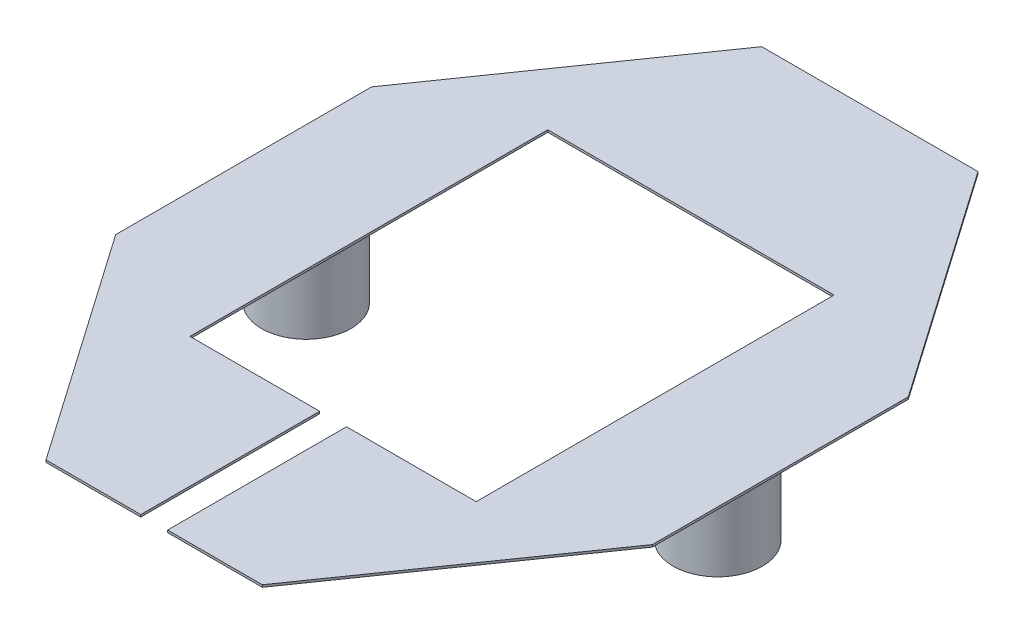
ISO-10303-21;
HEADER;
FILE_DESCRIPTION(('STEP AP214'),'2;1');
FILE_NAME('part.step','',(''),(''),'','','');
FILE_SCHEMA(('AUTOMOTIVE_DESIGN { 1 0 10303 214 1 1 1 1 }'));
ENDSEC;
DATA;
#1=APPLICATION_CONTEXT('core data for automotive mechanical design processes');
#2=APPLICATION_PROTOCOL_DEFINITION('international standard','automotive_design',2000,#1);
#3=PRODUCT_CONTEXT('',#1,'mechanical');
#4=PRODUCT('Part','Part','',(#3));
#5=PRODUCT_RELATED_PRODUCT_CATEGORY('part','',(#4));
#6=PRODUCT_DEFINITION_FORMATION('','',#4);
#7=PRODUCT_DEFINITION_CONTEXT('part definition',#1,'design');
#8=PRODUCT_DEFINITION('design','',#6,#7);
#9=PRODUCT_DEFINITION_SHAPE('','',#8);
#10=(LENGTH_UNIT() NAMED_UNIT(*) SI_UNIT(.MILLI.,.METRE.));
#11=(NAMED_UNIT(*) PLANE_ANGLE_UNIT() SI_UNIT($,.RADIAN.));
#12=(NAMED_UNIT(*) SI_UNIT($,.STERADIAN.) SOLID_ANGLE_UNIT());
#13=UNCERTAINTY_MEASURE_WITH_UNIT(LENGTH_MEASURE(1.E-05),#10,'distance_accuracy_value','');
#14=(GEOMETRIC_REPRESENTATION_CONTEXT(3) GLOBAL_UNCERTAINTY_ASSIGNED_CONTEXT((#13)) GLOBAL_UNIT_ASSIGNED_CONTEXT((#10,
#11,#12)) REPRESENTATION_CONTEXT('',''));
#15=CARTESIAN_POINT('',(0.,0.,0.));
#16=DIRECTION('',(0.,0.,1.));
#17=DIRECTION('',(1.,0.,0.));
#18=AXIS2_PLACEMENT_3D('',#15,#16,#17);
#19=CARTESIAN_POINT('',(0.,0.25,0.));
#20=DIRECTION('',(0.,1.,0.));
#21=DIRECTION('',(0.,0.,1.));
#22=AXIS2_PLACEMENT_3D('',#19,#20,#21);
#23=PLANE('',#22);
#24=DIRECTION('',(0.571792661688173,0.,-0.820398166769987));
#25=VECTOR('',#24,1.);
#26=CARTESIAN_POINT('',(5.,0.25,21.5));
#27=LINE('',#26,#25);
#28=CARTESIAN_POINT('',(6.04545454545455,0.25,20.));
#29=VERTEX_POINT('',#28);
#30=CARTESIAN_POINT('',(15.,0.249999999999999,7.15217391304348));
#31=VERTEX_POINT('',#30);
#32=EDGE_CURVE('E176',#29,#31,#27,.T.);
#33=ORIENTED_EDGE('',*,*,#32,.F.);
#34=DIRECTION('',(-1.,0.,0.));
#35=VECTOR('',#34,1.);
#36=CARTESIAN_POINT('',(5.,0.25,20.));
#37=LINE('',#36,#35);
#38=CARTESIAN_POINT('',(0.75,0.25,20.));
#39=VERTEX_POINT('',#38);
#40=EDGE_CURVE('E155',#29,#39,#37,.T.);
#41=ORIENTED_EDGE('',*,*,#40,.T.);
#42=DIRECTION('',(0.,0.,1.));
#43=VECTOR('',#42,1.);
#44=CARTESIAN_POINT('',(0.75,0.25,10.));
#45=LINE('',#44,#43);
#46=CARTESIAN_POINT('',(0.75,0.25,10.));
#47=VERTEX_POINT('',#46);
#48=EDGE_CURVE('E162',#47,#39,#45,.T.);
#49=ORIENTED_EDGE('',*,*,#48,.F.);
#50=DIRECTION('',(-1.,0.,0.));
#51=VECTOR('',#50,1.);
#52=CARTESIAN_POINT('',(-8.,0.25,10.));
#53=LINE('',#52,#51);
#54=CARTESIAN_POINT('',(8.,0.25,10.));
#55=VERTEX_POINT('',#54);
#56=EDGE_CURVE('E369',#55,#47,#53,.T.);
#57=ORIENTED_EDGE('',*,*,#56,.F.);
#58=DIRECTION('',(0.,0.,1.));
#59=VECTOR('',#58,1.);
#60=CARTESIAN_POINT('',(8.,0.25,-10.));
#61=LINE('',#60,#59);
#62=CARTESIAN_POINT('',(8.,0.25,-10.));
#63=VERTEX_POINT('',#62);
#64=EDGE_CURVE('E365',#63,#55,#61,.T.);
#65=ORIENTED_EDGE('',*,*,#64,.F.);
#66=DIRECTION('',(1.,0.,0.));
#67=VECTOR('',#66,1.);
#68=CARTESIAN_POINT('',(-8.,0.25,-10.));
#69=LINE('',#68,#67);
#70=CARTESIAN_POINT('',(-8.,0.25,-10.));
#71=VERTEX_POINT('',#70);
#72=EDGE_CURVE('E362',#71,#63,#69,.T.);
#73=ORIENTED_EDGE('',*,*,#72,.F.);
#74=DIRECTION('',(0.,0.,-1.));
#75=VECTOR('',#74,1.);
#76=CARTESIAN_POINT('',(-8.,0.25,-10.));
#77=LINE('',#76,#75);
#78=CARTESIAN_POINT('',(-8.,0.25,10.));
#79=VERTEX_POINT('',#78);
#80=EDGE_CURVE('E360',#79,#71,#77,.T.);
#81=ORIENTED_EDGE('',*,*,#80,.F.);
#82=CARTESIAN_POINT('',(-0.750000000000001,0.25,10.));
#83=VERTEX_POINT('',#82);
#84=EDGE_CURVE('E368',#83,#79,#53,.T.);
#85=ORIENTED_EDGE('',*,*,#84,.F.);
#86=DIRECTION('',(0.,0.,-1.));
#87=VECTOR('',#86,1.);
#88=CARTESIAN_POINT('',(-0.750000000000001,0.25,10.));
#89=LINE('',#88,#87);
#90=CARTESIAN_POINT('',(-0.75,0.25,20.));
#91=VERTEX_POINT('',#90);
#92=EDGE_CURVE('E171',#91,#83,#89,.T.);
#93=ORIENTED_EDGE('',*,*,#92,.F.);
#94=CARTESIAN_POINT('',(-6.04545454545455,0.249999999999999,20.));
#95=VERTEX_POINT('',#94);
#96=EDGE_CURVE('E177',#91,#95,#37,.T.);
#97=ORIENTED_EDGE('',*,*,#96,.T.);
#98=DIRECTION('',(0.571792661688173,0.,0.820398166769987));
#99=VECTOR('',#98,1.);
#100=CARTESIAN_POINT('',(-5.,0.25,21.5));
#101=LINE('',#100,#99);
#102=CARTESIAN_POINT('',(-15.,0.25,7.15217391304348));
#103=VERTEX_POINT('',#102);
#104=EDGE_CURVE('E355',#103,#95,#101,.T.);
#105=ORIENTED_EDGE('',*,*,#104,.F.);
#106=DIRECTION('',(0.,0.,-1.));
#107=VECTOR('',#106,1.);
#108=CARTESIAN_POINT('',(-15.,0.25,5.));
#109=LINE('',#108,#107);
#110=CARTESIAN_POINT('',(-15.,0.249999999999999,-7.15217391304348));
#111=VERTEX_POINT('',#110);
#112=EDGE_CURVE('E392',#103,#111,#109,.T.);
#113=ORIENTED_EDGE('',*,*,#112,.T.);
#114=DIRECTION('',(-0.571792661688173,0.,0.820398166769987));
#115=VECTOR('',#114,1.);
#116=CARTESIAN_POINT('',(-16.5,0.25,-5.));
#117=LINE('',#116,#115);
#118=CARTESIAN_POINT('',(-6.04545454545455,0.25,-20.));
#119=VERTEX_POINT('',#118);
#120=EDGE_CURVE('E346',#119,#111,#117,.T.);
#121=ORIENTED_EDGE('',*,*,#120,.F.);
#122=DIRECTION('',(1.,0.,0.));
#123=VECTOR('',#122,1.);
#124=CARTESIAN_POINT('',(-5.,0.25,-20.));
#125=LINE('',#124,#123);
#126=CARTESIAN_POINT('',(6.04545454545454,0.249999999999999,-20.));
#127=VERTEX_POINT('',#126);
#128=EDGE_CURVE('E393',#119,#127,#125,.T.);
#129=ORIENTED_EDGE('',*,*,#128,.T.);
#130=DIRECTION('',(-0.571792661688173,0.,-0.820398166769987));
#131=VECTOR('',#130,1.);
#132=CARTESIAN_POINT('',(16.5,0.25,-5.));
#133=LINE('',#132,#131);
#134=CARTESIAN_POINT('',(15.,0.25,-7.15217391304348));
#135=VERTEX_POINT('',#134);
#136=EDGE_CURVE('E341',#135,#127,#133,.T.);
#137=ORIENTED_EDGE('',*,*,#136,.F.);
#138=DIRECTION('',(0.,0.,1.));
#139=VECTOR('',#138,1.);
#140=CARTESIAN_POINT('',(15.,0.25,-5.));
#141=LINE('',#140,#139);
#142=EDGE_CURVE('E181',#135,#31,#141,.T.);
#143=ORIENTED_EDGE('',*,*,#142,.T.);
#144=EDGE_LOOP('',(#33,#41,#49,#57,#65,#73,#81,#85,#93,#97,#105,#113,#121,#129,#137,#143));
#145=FACE_BOUND('',#144,.T.);
#146=CARTESIAN_POINT('',(-11.5,0.25,0.));
#147=DIRECTION('',(0.,1.,0.));
#148=DIRECTION('',(0.,0.,1.));
#149=AXIS2_PLACEMENT_3D('',#146,#147,#148);
#150=CIRCLE('',#149,2.5);
#151=CARTESIAN_POINT('',(-11.5,0.25,2.5));
#152=VERTEX_POINT('',#151);
#153=EDGE_CURVE('E43',#152,#152,#150,.F.);
#154=ORIENTED_EDGE('',*,*,#153,.F.);
#155=EDGE_LOOP('',(#154));
#156=FACE_BOUND('',#155,.T.);
#157=CARTESIAN_POINT('',(11.5,0.25,0.));
#158=DIRECTION('',(0.,1.,0.));
#159=DIRECTION('',(0.,0.,1.));
#160=AXIS2_PLACEMENT_3D('',#157,#158,#159);
#161=CIRCLE('',#160,2.5);
#162=CARTESIAN_POINT('',(11.5,0.25,2.5));
#163=VERTEX_POINT('',#162);
#164=EDGE_CURVE('E11',#163,#163,#161,.F.);
#165=ORIENTED_EDGE('',*,*,#164,.F.);
#166=EDGE_LOOP('',(#165));
#167=FACE_BOUND('',#166,.T.);
#168=ADVANCED_FACE('F35',(#145,#156,#167),#23,.F.);
#169=CARTESIAN_POINT('',(-8.,4.375,10.));
#170=DIRECTION('',(0.,0.,1.));
#171=DIRECTION('',(1.,0.,0.));
#172=AXIS2_PLACEMENT_3D('',#169,#170,#171);
#173=PLANE('',#172);
#174=DIRECTION('',(1.,0.,0.));
#175=VECTOR('',#174,1.);
#176=CARTESIAN_POINT('',(0.,0.375,10.));
#177=LINE('',#176,#175);
#178=CARTESIAN_POINT('',(-8.,0.375,10.));
#179=VERTEX_POINT('',#178);
#180=CARTESIAN_POINT('',(-0.750000000000001,0.375,10.));
#181=VERTEX_POINT('',#180);
#182=EDGE_CURVE('E387',#179,#181,#177,.T.);
#183=ORIENTED_EDGE('',*,*,#182,.T.);
#184=DIRECTION('',(0.,-1.,0.));
#185=VECTOR('',#184,1.);
#186=CARTESIAN_POINT('',(-0.750000000000001,4.375,10.));
#187=LINE('',#186,#185);
#188=EDGE_CURVE('E179',#181,#83,#187,.T.);
#189=ORIENTED_EDGE('',*,*,#188,.T.);
#190=ORIENTED_EDGE('',*,*,#84,.T.);
#191=DIRECTION('',(0.,-1.,0.));
#192=VECTOR('',#191,1.);
#193=CARTESIAN_POINT('',(-8.,4.375,10.));
#194=LINE('',#193,#192);
#195=EDGE_CURVE('E372',#179,#79,#194,.T.);
#196=ORIENTED_EDGE('',*,*,#195,.F.);
#197=EDGE_LOOP('',(#183,#189,#190,#196));
#198=FACE_BOUND('',#197,.T.);
#199=ADVANCED_FACE('F199',(#198),#173,.F.);
#200=CARTESIAN_POINT('',(0.,0.375,0.));
#201=DIRECTION('',(0.,1.,0.));
#202=DIRECTION('',(0.,0.,1.));
#203=AXIS2_PLACEMENT_3D('',#200,#201,#202);
#204=PLANE('',#203);
#205=DIRECTION('',(-1.,0.,0.));
#206=VECTOR('',#205,1.);
#207=CARTESIAN_POINT('',(0.,0.375,20.));
#208=LINE('',#207,#206);
#209=CARTESIAN_POINT('',(6.04545454545455,0.375,20.));
#210=VERTEX_POINT('',#209);
#211=CARTESIAN_POINT('',(0.75,0.375,20.));
#212=VERTEX_POINT('',#211);
#213=EDGE_CURVE('E158',#210,#212,#208,.T.);
#214=ORIENTED_EDGE('',*,*,#213,.F.);
#215=DIRECTION('',(-0.571792661688173,0.,0.820398166769987));
#216=VECTOR('',#215,1.);
#217=CARTESIAN_POINT('',(13.4508652657602,0.375,9.37484548825711));
#218=LINE('',#217,#216);
#219=CARTESIAN_POINT('',(15.,0.375,7.15217391304347));
#220=VERTEX_POINT('',#219);
#221=EDGE_CURVE('E352',#220,#210,#218,.T.);
#222=ORIENTED_EDGE('',*,*,#221,.F.);
#223=DIRECTION('',(0.,0.,1.));
#224=VECTOR('',#223,1.);
#225=CARTESIAN_POINT('',(15.,0.375,0.));
#226=LINE('',#225,#224);
#227=CARTESIAN_POINT('',(15.,0.375,-7.15217391304348));
#228=VERTEX_POINT('',#227);
#229=EDGE_CURVE('E328',#228,#220,#226,.T.);
#230=ORIENTED_EDGE('',*,*,#229,.F.);
#231=DIRECTION('',(0.571792661688173,0.,0.820398166769987));
#232=VECTOR('',#231,1.);
#233=CARTESIAN_POINT('',(13.4508652657602,0.375,-9.37484548825711));
#234=LINE('',#233,#232);
#235=CARTESIAN_POINT('',(6.04545454545454,0.375,-20.));
#236=VERTEX_POINT('',#235);
#237=EDGE_CURVE('E344',#236,#228,#234,.T.);
#238=ORIENTED_EDGE('',*,*,#237,.F.);
#239=DIRECTION('',(1.,0.,0.));
#240=VECTOR('',#239,1.);
#241=CARTESIAN_POINT('',(0.,0.375,-20.));
#242=LINE('',#241,#240);
#243=CARTESIAN_POINT('',(-6.04545454545455,0.375,-20.));
#244=VERTEX_POINT('',#243);
#245=EDGE_CURVE('E58',#244,#236,#242,.T.);
#246=ORIENTED_EDGE('',*,*,#245,.F.);
#247=DIRECTION('',(0.571792661688173,0.,-0.820398166769987));
#248=VECTOR('',#247,1.);
#249=CARTESIAN_POINT('',(-13.4508652657602,0.375,-9.37484548825711));
#250=LINE('',#249,#248);
#251=CARTESIAN_POINT('',(-15.,0.375,-7.15217391304348));
#252=VERTEX_POINT('',#251);
#253=EDGE_CURVE('E349',#252,#244,#250,.T.);
#254=ORIENTED_EDGE('',*,*,#253,.F.);
#255=DIRECTION('',(0.,0.,-1.));
#256=VECTOR('',#255,1.);
#257=CARTESIAN_POINT('',(-15.,0.375,0.));
#258=LINE('',#257,#256);
#259=CARTESIAN_POINT('',(-15.,0.375,7.15217391304348));
#260=VERTEX_POINT('',#259);
#261=EDGE_CURVE('E50',#260,#252,#258,.T.);
#262=ORIENTED_EDGE('',*,*,#261,.F.);
#263=DIRECTION('',(-0.571792661688173,0.,-0.820398166769987));
#264=VECTOR('',#263,1.);
#265=CARTESIAN_POINT('',(-13.4508652657602,0.375,9.37484548825711));
#266=LINE('',#265,#264);
#267=CARTESIAN_POINT('',(-6.04545454545455,0.375,20.));
#268=VERTEX_POINT('',#267);
#269=EDGE_CURVE('E358',#268,#260,#266,.T.);
#270=ORIENTED_EDGE('',*,*,#269,.F.);
#271=CARTESIAN_POINT('',(-0.75,0.375,20.));
#272=VERTEX_POINT('',#271);
#273=EDGE_CURVE('E314',#272,#268,#208,.T.);
#274=ORIENTED_EDGE('',*,*,#273,.F.);
#275=DIRECTION('',(0.,0.,1.));
#276=VECTOR('',#275,1.);
#277=CARTESIAN_POINT('',(-0.750000000000001,0.375,0.));
#278=LINE('',#277,#276);
#279=EDGE_CURVE('E338',#181,#272,#278,.T.);
#280=ORIENTED_EDGE('',*,*,#279,.F.);
#281=ORIENTED_EDGE('',*,*,#182,.F.);
#282=DIRECTION('',(0.,0.,1.));
#283=VECTOR('',#282,1.);
#284=CARTESIAN_POINT('',(-8.,0.375,0.));
#285=LINE('',#284,#283);
#286=CARTESIAN_POINT('',(-8.,0.375,-10.));
#287=VERTEX_POINT('',#286);
#288=EDGE_CURVE('E390',#287,#179,#285,.T.);
#289=ORIENTED_EDGE('',*,*,#288,.F.);
#290=DIRECTION('',(-1.,0.,0.));
#291=VECTOR('',#290,1.);
#292=CARTESIAN_POINT('',(0.,0.375,-10.));
#293=LINE('',#292,#291);
#294=CARTESIAN_POINT('',(8.,0.375,-10.));
#295=VERTEX_POINT('',#294);
#296=EDGE_CURVE('E375',#295,#287,#293,.T.);
#297=ORIENTED_EDGE('',*,*,#296,.F.);
#298=DIRECTION('',(0.,0.,-1.));
#299=VECTOR('',#298,1.);
#300=CARTESIAN_POINT('',(8.,0.375,0.));
#301=LINE('',#300,#299);
#302=CARTESIAN_POINT('',(8.,0.375,10.));
#303=VERTEX_POINT('',#302);
#304=EDGE_CURVE('E383',#303,#295,#301,.T.);
#305=ORIENTED_EDGE('',*,*,#304,.F.);
#306=CARTESIAN_POINT('',(0.750000000000001,0.375,10.));
#307=VERTEX_POINT('',#306);
#308=EDGE_CURVE('E386',#307,#303,#177,.T.);
#309=ORIENTED_EDGE('',*,*,#308,.F.);
#310=DIRECTION('',(0.,0.,-1.));
#311=VECTOR('',#310,1.);
#312=CARTESIAN_POINT('',(0.75,0.375,0.));
#313=LINE('',#312,#311);
#314=EDGE_CURVE('E335',#212,#307,#313,.T.);
#315=ORIENTED_EDGE('',*,*,#314,.F.);
#316=EDGE_LOOP('',(#214,#222,#230,#238,#246,#254,#262,#270,#274,#280,#281,#289,#297,#305,#309,#315));
#317=FACE_BOUND('',#316,.T.);
#318=ADVANCED_FACE('F37',(#317),#204,.T.);
#319=CARTESIAN_POINT('',(-8.,4.375,-10.));
#320=DIRECTION('',(-1.,0.,0.));
#321=DIRECTION('',(0.,0.,1.));
#322=AXIS2_PLACEMENT_3D('',#319,#320,#321);
#323=PLANE('',#322);
#324=ORIENTED_EDGE('',*,*,#288,.T.);
#325=ORIENTED_EDGE('',*,*,#195,.T.);
#326=ORIENTED_EDGE('',*,*,#80,.T.);
#327=DIRECTION('',(0.,-1.,0.));
#328=VECTOR('',#327,1.);
#329=CARTESIAN_POINT('',(-8.,4.375,-10.));
#330=LINE('',#329,#328);
#331=EDGE_CURVE('E371',#287,#71,#330,.T.);
#332=ORIENTED_EDGE('',*,*,#331,.F.);
#333=EDGE_LOOP('',(#324,#325,#326,#332));
#334=FACE_BOUND('',#333,.T.);
#335=ADVANCED_FACE('F271',(#334),#323,.F.);
#336=ORIENTED_EDGE('',*,*,#56,.T.);
#337=DIRECTION('',(0.,1.,0.));
#338=VECTOR('',#337,1.);
#339=CARTESIAN_POINT('',(0.750000000000001,4.375,10.));
#340=LINE('',#339,#338);
#341=EDGE_CURVE('E167',#47,#307,#340,.T.);
#342=ORIENTED_EDGE('',*,*,#341,.T.);
#343=ORIENTED_EDGE('',*,*,#308,.T.);
#344=DIRECTION('',(0.,-1.,0.));
#345=VECTOR('',#344,1.);
#346=CARTESIAN_POINT('',(8.,4.375,10.));
#347=LINE('',#346,#345);
#348=EDGE_CURVE('E376',#303,#55,#347,.T.);
#349=ORIENTED_EDGE('',*,*,#348,.T.);
#350=EDGE_LOOP('',(#336,#342,#343,#349));
#351=FACE_BOUND('',#350,.T.);
#352=ADVANCED_FACE('F267',(#351),#173,.F.);
#353=CARTESIAN_POINT('',(8.,4.375,-10.));
#354=DIRECTION('',(1.,0.,0.));
#355=DIRECTION('',(0.,0.,-1.));
#356=AXIS2_PLACEMENT_3D('',#353,#354,#355);
#357=PLANE('',#356);
#358=ORIENTED_EDGE('',*,*,#304,.T.);
#359=DIRECTION('',(0.,-1.,0.));
#360=VECTOR('',#359,1.);
#361=CARTESIAN_POINT('',(8.,4.375,-10.));
#362=LINE('',#361,#360);
#363=EDGE_CURVE('E378',#295,#63,#362,.T.);
#364=ORIENTED_EDGE('',*,*,#363,.T.);
#365=ORIENTED_EDGE('',*,*,#64,.T.);
#366=ORIENTED_EDGE('',*,*,#348,.F.);
#367=EDGE_LOOP('',(#358,#364,#365,#366));
#368=FACE_BOUND('',#367,.T.);
#369=ADVANCED_FACE('F270',(#368),#357,.F.);
#370=CARTESIAN_POINT('',(-8.,4.375,-10.));
#371=DIRECTION('',(0.,0.,-1.));
#372=DIRECTION('',(-1.,0.,0.));
#373=AXIS2_PLACEMENT_3D('',#370,#371,#372);
#374=PLANE('',#373);
#375=ORIENTED_EDGE('',*,*,#296,.T.);
#376=ORIENTED_EDGE('',*,*,#331,.T.);
#377=ORIENTED_EDGE('',*,*,#72,.T.);
#378=ORIENTED_EDGE('',*,*,#363,.F.);
#379=EDGE_LOOP('',(#375,#376,#377,#378));
#380=FACE_BOUND('',#379,.T.);
#381=ADVANCED_FACE('F265',(#380),#374,.F.);
#382=CARTESIAN_POINT('',(-5.,4.375,21.5));
#383=DIRECTION('',(0.820398166769987,0.,-0.571792661688173));
#384=DIRECTION('',(-0.571792661688173,0.,-0.820398166769987));
#385=AXIS2_PLACEMENT_3D('',#382,#383,#384);
#386=PLANE('',#385);
#387=ORIENTED_EDGE('',*,*,#104,.T.);
#388=DIRECTION('',(0.,1.,0.));
#389=VECTOR('',#388,1.);
#390=CARTESIAN_POINT('',(-6.04545454545455,4.375,20.));
#391=LINE('',#390,#389);
#392=EDGE_CURVE('E316',#95,#268,#391,.T.);
#393=ORIENTED_EDGE('',*,*,#392,.T.);
#394=ORIENTED_EDGE('',*,*,#269,.T.);
#395=DIRECTION('',(0.,-1.,0.));
#396=VECTOR('',#395,1.);
#397=CARTESIAN_POINT('',(-15.,4.375,7.15217391304348));
#398=LINE('',#397,#396);
#399=EDGE_CURVE('E321',#260,#103,#398,.T.);
#400=ORIENTED_EDGE('',*,*,#399,.T.);
#401=EDGE_LOOP('',(#387,#393,#394,#400));
#402=FACE_BOUND('',#401,.T.);
#403=ADVANCED_FACE('F261',(#402),#386,.F.);
#404=CARTESIAN_POINT('',(5.,4.375,21.5));
#405=DIRECTION('',(-0.820398166769987,0.,-0.571792661688173));
#406=DIRECTION('',(-0.571792661688173,0.,0.820398166769987));
#407=AXIS2_PLACEMENT_3D('',#404,#405,#406);
#408=PLANE('',#407);
#409=ORIENTED_EDGE('',*,*,#221,.T.);
#410=DIRECTION('',(0.,-1.,0.));
#411=VECTOR('',#410,1.);
#412=CARTESIAN_POINT('',(6.04545454545455,4.375,20.));
#413=LINE('',#412,#411);
#414=EDGE_CURVE('E313',#210,#29,#413,.T.);
#415=ORIENTED_EDGE('',*,*,#414,.T.);
#416=ORIENTED_EDGE('',*,*,#32,.T.);
#417=DIRECTION('',(0.,1.,0.));
#418=VECTOR('',#417,1.);
#419=CARTESIAN_POINT('',(15.,4.375,7.15217391304348));
#420=LINE('',#419,#418);
#421=EDGE_CURVE('E330',#31,#220,#420,.T.);
#422=ORIENTED_EDGE('',*,*,#421,.T.);
#423=EDGE_LOOP('',(#409,#415,#416,#422));
#424=FACE_BOUND('',#423,.T.);
#425=ADVANCED_FACE('F257',(#424),#408,.F.);
#426=CARTESIAN_POINT('',(-16.5,4.375,-5.));
#427=DIRECTION('',(0.820398166769987,0.,0.571792661688173));
#428=DIRECTION('',(0.571792661688173,0.,-0.820398166769987));
#429=AXIS2_PLACEMENT_3D('',#426,#427,#428);
#430=PLANE('',#429);
#431=ORIENTED_EDGE('',*,*,#120,.T.);
#432=DIRECTION('',(0.,1.,0.));
#433=VECTOR('',#432,1.);
#434=CARTESIAN_POINT('',(-15.,4.375,-7.15217391304348));
#435=LINE('',#434,#433);
#436=EDGE_CURVE('E192',#111,#252,#435,.T.);
#437=ORIENTED_EDGE('',*,*,#436,.T.);
#438=ORIENTED_EDGE('',*,*,#253,.T.);
#439=DIRECTION('',(0.,-1.,0.));
#440=VECTOR('',#439,1.);
#441=CARTESIAN_POINT('',(-6.04545454545454,4.375,-20.));
#442=LINE('',#441,#440);
#443=EDGE_CURVE('E325',#244,#119,#442,.T.);
#444=ORIENTED_EDGE('',*,*,#443,.T.);
#445=EDGE_LOOP('',(#431,#437,#438,#444));
#446=FACE_BOUND('',#445,.T.);
#447=ADVANCED_FACE('F253',(#446),#430,.F.);
#448=CARTESIAN_POINT('',(16.5,4.375,-5.));
#449=DIRECTION('',(-0.820398166769987,0.,0.571792661688173));
#450=DIRECTION('',(0.571792661688173,0.,0.820398166769987));
#451=AXIS2_PLACEMENT_3D('',#448,#449,#450);
#452=PLANE('',#451);
#453=ORIENTED_EDGE('',*,*,#136,.T.);
#454=DIRECTION('',(0.,1.,0.));
#455=VECTOR('',#454,1.);
#456=CARTESIAN_POINT('',(6.04545454545454,4.375,-20.));
#457=LINE('',#456,#455);
#458=EDGE_CURVE('E190',#127,#236,#457,.T.);
#459=ORIENTED_EDGE('',*,*,#458,.T.);
#460=ORIENTED_EDGE('',*,*,#237,.T.);
#461=DIRECTION('',(0.,-1.,0.));
#462=VECTOR('',#461,1.);
#463=CARTESIAN_POINT('',(15.,4.375,-7.15217391304348));
#464=LINE('',#463,#462);
#465=EDGE_CURVE('E187',#228,#135,#464,.T.);
#466=ORIENTED_EDGE('',*,*,#465,.T.);
#467=EDGE_LOOP('',(#453,#459,#460,#466));
#468=FACE_BOUND('',#467,.T.);
#469=ADVANCED_FACE('F249',(#468),#452,.F.);
#470=CARTESIAN_POINT('',(-0.750000000000001,10.25,10.));
#471=DIRECTION('',(-1.,0.,0.));
#472=DIRECTION('',(0.,0.,1.));
#473=AXIS2_PLACEMENT_3D('',#470,#471,#472);
#474=PLANE('',#473);
#475=ORIENTED_EDGE('',*,*,#279,.T.);
#476=DIRECTION('',(0.,-1.,0.));
#477=VECTOR('',#476,1.);
#478=CARTESIAN_POINT('',(-0.75,10.25,20.));
#479=LINE('',#478,#477);
#480=EDGE_CURVE('E161',#272,#91,#479,.T.);
#481=ORIENTED_EDGE('',*,*,#480,.T.);
#482=ORIENTED_EDGE('',*,*,#92,.T.);
#483=ORIENTED_EDGE('',*,*,#188,.F.);
#484=EDGE_LOOP('',(#475,#481,#482,#483));
#485=FACE_BOUND('',#484,.T.);
#486=ADVANCED_FACE('F246',(#485),#474,.F.);
#487=CARTESIAN_POINT('',(0.75,10.25,10.));
#488=DIRECTION('',(1.,0.,0.));
#489=DIRECTION('',(0.,0.,-1.));
#490=AXIS2_PLACEMENT_3D('',#487,#488,#489);
#491=PLANE('',#490);
#492=ORIENTED_EDGE('',*,*,#314,.T.);
#493=ORIENTED_EDGE('',*,*,#341,.F.);
#494=ORIENTED_EDGE('',*,*,#48,.T.);
#495=DIRECTION('',(0.,-1.,0.));
#496=VECTOR('',#495,1.);
#497=CARTESIAN_POINT('',(0.75,10.25,20.));
#498=LINE('',#497,#496);
#499=EDGE_CURVE('E151',#212,#39,#498,.T.);
#500=ORIENTED_EDGE('',*,*,#499,.F.);
#501=EDGE_LOOP('',(#492,#493,#494,#500));
#502=FACE_BOUND('',#501,.T.);
#503=ADVANCED_FACE('F165',(#502),#491,.F.);
#504=CARTESIAN_POINT('',(15.,5.25,11.1435842001284));
#505=DIRECTION('',(-1.,0.,0.));
#506=DIRECTION('',(0.,0.,1.));
#507=AXIS2_PLACEMENT_3D('',#504,#505,#506);
#508=PLANE('',#507);
#509=ORIENTED_EDGE('',*,*,#142,.F.);
#510=ORIENTED_EDGE('',*,*,#465,.F.);
#511=ORIENTED_EDGE('',*,*,#229,.T.);
#512=ORIENTED_EDGE('',*,*,#421,.F.);
#513=EDGE_LOOP('',(#509,#510,#511,#512));
#514=FACE_BOUND('',#513,.T.);
#515=ADVANCED_FACE('F240',(#514),#508,.F.);
#516=CARTESIAN_POINT('',(10.874608008316,5.25,-20.));
#517=DIRECTION('',(0.,0.,1.));
#518=DIRECTION('',(1.,0.,0.));
#519=AXIS2_PLACEMENT_3D('',#516,#517,#518);
#520=PLANE('',#519);
#521=ORIENTED_EDGE('',*,*,#245,.T.);
#522=ORIENTED_EDGE('',*,*,#458,.F.);
#523=ORIENTED_EDGE('',*,*,#128,.F.);
#524=ORIENTED_EDGE('',*,*,#443,.F.);
#525=EDGE_LOOP('',(#521,#522,#523,#524));
#526=FACE_BOUND('',#525,.T.);
#527=ADVANCED_FACE('F237',(#526),#520,.F.);
#528=CARTESIAN_POINT('',(-15.,5.25,10.1349512165065));
#529=DIRECTION('',(1.,0.,0.));
#530=DIRECTION('',(0.,0.,-1.));
#531=AXIS2_PLACEMENT_3D('',#528,#529,#530);
#532=PLANE('',#531);
#533=ORIENTED_EDGE('',*,*,#261,.T.);
#534=ORIENTED_EDGE('',*,*,#436,.F.);
#535=ORIENTED_EDGE('',*,*,#112,.F.);
#536=ORIENTED_EDGE('',*,*,#399,.F.);
#537=EDGE_LOOP('',(#533,#534,#535,#536));
#538=FACE_BOUND('',#537,.T.);
#539=ADVANCED_FACE('F234',(#538),#532,.F.);
#540=CARTESIAN_POINT('',(-14.7988010881341,5.25,20.));
#541=DIRECTION('',(0.,0.,-1.));
#542=DIRECTION('',(-1.,0.,0.));
#543=AXIS2_PLACEMENT_3D('',#540,#541,#542);
#544=PLANE('',#543);
#545=ORIENTED_EDGE('',*,*,#213,.T.);
#546=ORIENTED_EDGE('',*,*,#499,.T.);
#547=ORIENTED_EDGE('',*,*,#40,.F.);
#548=ORIENTED_EDGE('',*,*,#414,.F.);
#549=EDGE_LOOP('',(#545,#546,#547,#548));
#550=FACE_BOUND('',#549,.T.);
#551=ADVANCED_FACE('F153',(#550),#544,.F.);
#552=ORIENTED_EDGE('',*,*,#273,.T.);
#553=ORIENTED_EDGE('',*,*,#392,.F.);
#554=ORIENTED_EDGE('',*,*,#96,.F.);
#555=ORIENTED_EDGE('',*,*,#480,.F.);
#556=EDGE_LOOP('',(#552,#553,#554,#555));
#557=FACE_BOUND('',#556,.T.);
#558=ADVANCED_FACE('F227',(#557),#544,.F.);
#559=CARTESIAN_POINT('',(-11.5,-4.75,0.));
#560=DIRECTION('',(0.,-1.,0.));
#561=DIRECTION('',(0.,0.,-1.));
#562=AXIS2_PLACEMENT_3D('',#559,#560,#561);
#563=PLANE('',#562);
#564=CARTESIAN_POINT('',(-11.5,-4.75,0.));
#565=DIRECTION('',(0.,-1.,0.));
#566=DIRECTION('',(0.,0.,-1.));
#567=AXIS2_PLACEMENT_3D('',#564,#565,#566);
#568=CIRCLE('',#567,2.5);
#569=CARTESIAN_POINT('',(-11.5,-4.75,-2.5));
#570=VERTEX_POINT('',#569);
#571=EDGE_CURVE('E309',#570,#570,#568,.T.);
#572=ORIENTED_EDGE('',*,*,#571,.T.);
#573=EDGE_LOOP('',(#572));
#574=FACE_BOUND('',#573,.T.);
#575=CARTESIAN_POINT('',(-11.5,-4.75,0.));
#576=DIRECTION('',(0.,-1.,0.));
#577=DIRECTION('',(0.,0.,-1.));
#578=AXIS2_PLACEMENT_3D('',#575,#576,#577);
#579=CIRCLE('',#578,1.5);
#580=CARTESIAN_POINT('',(-11.5,-4.75,-1.5));
#581=VERTEX_POINT('',#580);
#582=EDGE_CURVE('E306',#581,#581,#579,.T.);
#583=ORIENTED_EDGE('',*,*,#582,.F.);
#584=EDGE_LOOP('',(#583));
#585=FACE_BOUND('',#584,.T.);
#586=ADVANCED_FACE('F224',(#574,#585),#563,.T.);
#587=CARTESIAN_POINT('',(-11.5,-4.75,0.));
#588=DIRECTION('',(0.,1.,0.));
#589=DIRECTION('',(0.,0.,1.));
#590=AXIS2_PLACEMENT_3D('',#587,#588,#589);
#591=CYLINDRICAL_SURFACE('',#590,2.5);
#592=ORIENTED_EDGE('',*,*,#571,.F.);
#593=EDGE_LOOP('',(#592));
#594=FACE_BOUND('',#593,.T.);
#595=ORIENTED_EDGE('',*,*,#153,.T.);
#596=EDGE_LOOP('',(#595));
#597=FACE_BOUND('',#596,.T.);
#598=ADVANCED_FACE('F196',(#594,#597),#591,.T.);
#599=CARTESIAN_POINT('',(-11.5,-4.75,0.));
#600=DIRECTION('',(0.,1.,0.));
#601=DIRECTION('',(0.,0.,1.));
#602=AXIS2_PLACEMENT_3D('',#599,#600,#601);
#603=CYLINDRICAL_SURFACE('',#602,1.5);
#604=ORIENTED_EDGE('',*,*,#582,.T.);
#605=EDGE_LOOP('',(#604));
#606=FACE_BOUND('',#605,.T.);
#607=CARTESIAN_POINT('',(-11.5,0.25,0.));
#608=DIRECTION('',(0.,-1.,0.));
#609=DIRECTION('',(0.,0.,-1.));
#610=AXIS2_PLACEMENT_3D('',#607,#608,#609);
#611=CIRCLE('',#610,1.5);
#612=CARTESIAN_POINT('',(-11.5,0.25,-1.5));
#613=VERTEX_POINT('',#612);
#614=EDGE_CURVE('E305',#613,#613,#611,.T.);
#615=ORIENTED_EDGE('',*,*,#614,.F.);
#616=EDGE_LOOP('',(#615));
#617=FACE_BOUND('',#616,.T.);
#618=ADVANCED_FACE('F220',(#606,#617),#603,.F.);
#619=ORIENTED_EDGE('',*,*,#614,.T.);
#620=EDGE_LOOP('',(#619));
#621=FACE_BOUND('',#620,.T.);
#622=ADVANCED_FACE('F201',(#621),#23,.F.);
#623=CARTESIAN_POINT('',(11.5,-4.75,0.));
#624=DIRECTION('',(0.,-1.,0.));
#625=DIRECTION('',(0.,0.,-1.));
#626=AXIS2_PLACEMENT_3D('',#623,#624,#625);
#627=PLANE('',#626);
#628=CARTESIAN_POINT('',(11.5,-4.75,0.));
#629=DIRECTION('',(0.,-1.,0.));
#630=DIRECTION('',(0.,0.,-1.));
#631=AXIS2_PLACEMENT_3D('',#628,#629,#630);
#632=CIRCLE('',#631,2.5);
#633=CARTESIAN_POINT('',(11.5,-4.75,-2.5));
#634=VERTEX_POINT('',#633);
#635=EDGE_CURVE('E300',#634,#634,#632,.T.);
#636=ORIENTED_EDGE('',*,*,#635,.T.);
#637=EDGE_LOOP('',(#636));
#638=FACE_BOUND('',#637,.T.);
#639=CARTESIAN_POINT('',(11.5,-4.75,0.));
#640=DIRECTION('',(0.,-1.,0.));
#641=DIRECTION('',(0.,0.,-1.));
#642=AXIS2_PLACEMENT_3D('',#639,#640,#641);
#643=CIRCLE('',#642,1.5);
#644=CARTESIAN_POINT('',(11.5,-4.75,-1.5));
#645=VERTEX_POINT('',#644);
#646=EDGE_CURVE('E297',#645,#645,#643,.T.);
#647=ORIENTED_EDGE('',*,*,#646,.F.);
#648=EDGE_LOOP('',(#647));
#649=FACE_BOUND('',#648,.T.);
#650=ADVANCED_FACE('F207',(#638,#649),#627,.T.);
#651=CARTESIAN_POINT('',(11.5,-4.75,0.));
#652=DIRECTION('',(0.,1.,0.));
#653=DIRECTION('',(0.,0.,1.));
#654=AXIS2_PLACEMENT_3D('',#651,#652,#653);
#655=CYLINDRICAL_SURFACE('',#654,2.5);
#656=ORIENTED_EDGE('',*,*,#635,.F.);
#657=EDGE_LOOP('',(#656));
#658=FACE_BOUND('',#657,.T.);
#659=ORIENTED_EDGE('',*,*,#164,.T.);
#660=EDGE_LOOP('',(#659));
#661=FACE_BOUND('',#660,.T.);
#662=ADVANCED_FACE('F204',(#658,#661),#655,.T.);
#663=CARTESIAN_POINT('',(11.5,-4.75,0.));
#664=DIRECTION('',(0.,1.,0.));
#665=DIRECTION('',(0.,0.,1.));
#666=AXIS2_PLACEMENT_3D('',#663,#664,#665);
#667=CYLINDRICAL_SURFACE('',#666,1.5);
#668=ORIENTED_EDGE('',*,*,#646,.T.);
#669=EDGE_LOOP('',(#668));
#670=FACE_BOUND('',#669,.T.);
#671=CARTESIAN_POINT('',(11.5,0.25,0.));
#672=DIRECTION('',(0.,-1.,0.));
#673=DIRECTION('',(0.,0.,-1.));
#674=AXIS2_PLACEMENT_3D('',#671,#672,#673);
#675=CIRCLE('',#674,1.5);
#676=CARTESIAN_POINT('',(11.5,0.25,-1.5));
#677=VERTEX_POINT('',#676);
#678=EDGE_CURVE('E295',#677,#677,#675,.T.);
#679=ORIENTED_EDGE('',*,*,#678,.F.);
#680=EDGE_LOOP('',(#679));
#681=FACE_BOUND('',#680,.T.);
#682=ADVANCED_FACE('F206',(#670,#681),#667,.F.);
#683=ORIENTED_EDGE('',*,*,#678,.T.);
#684=EDGE_LOOP('',(#683));
#685=FACE_BOUND('',#684,.T.);
#686=ADVANCED_FACE('F200',(#685),#23,.F.);
#687=CLOSED_SHELL('',(#168,#199,#318,#335,#352,#369,#381,#403,#425,#447,#469,#486,#503,#515,
#527,#539,#551,#558,#586,#598,#618,#622,#650,#662,#682,#686));
#688=MANIFOLD_SOLID_BREP('B2',#687);
#689=ADVANCED_BREP_SHAPE_REPRESENTATION('',(#18,#688),#14);
#690=SHAPE_DEFINITION_REPRESENTATION(#9,#689);
ENDSEC;
END-ISO-10303-21;
